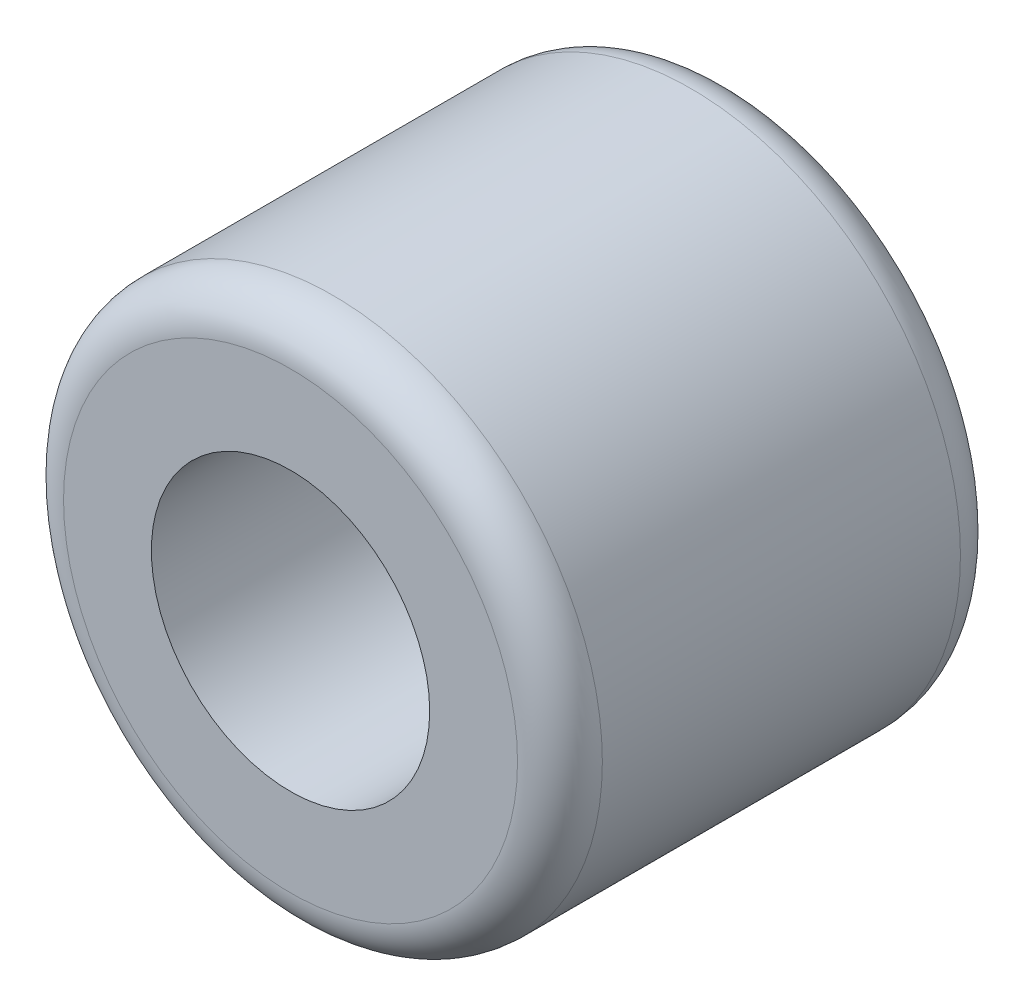
ISO-10303-21;
HEADER;
FILE_DESCRIPTION(('STEP AP214'),'2;1');
FILE_NAME('part.step','',(''),(''),'','','');
FILE_SCHEMA(('AUTOMOTIVE_DESIGN { 1 0 10303 214 1 1 1 1 }'));
ENDSEC;
DATA;
#1=APPLICATION_CONTEXT('core data for automotive mechanical design processes');
#2=APPLICATION_PROTOCOL_DEFINITION('international standard','automotive_design',2000,#1);
#3=PRODUCT_CONTEXT('',#1,'mechanical');
#4=PRODUCT('Part','Part','',(#3));
#5=PRODUCT_RELATED_PRODUCT_CATEGORY('part','',(#4));
#6=PRODUCT_DEFINITION_FORMATION('','',#4);
#7=PRODUCT_DEFINITION_CONTEXT('part definition',#1,'design');
#8=PRODUCT_DEFINITION('design','',#6,#7);
#9=PRODUCT_DEFINITION_SHAPE('','',#8);
#10=(LENGTH_UNIT() NAMED_UNIT(*) SI_UNIT(.MILLI.,.METRE.));
#11=(NAMED_UNIT(*) PLANE_ANGLE_UNIT() SI_UNIT($,.RADIAN.));
#12=(NAMED_UNIT(*) SI_UNIT($,.STERADIAN.) SOLID_ANGLE_UNIT());
#13=UNCERTAINTY_MEASURE_WITH_UNIT(LENGTH_MEASURE(1.E-05),#10,'distance_accuracy_value','');
#14=(GEOMETRIC_REPRESENTATION_CONTEXT(3) GLOBAL_UNCERTAINTY_ASSIGNED_CONTEXT((#13)) GLOBAL_UNIT_ASSIGNED_CONTEXT((#10,
#11,#12)) REPRESENTATION_CONTEXT('',''));
#15=CARTESIAN_POINT('',(0.,0.,0.));
#16=DIRECTION('',(0.,0.,1.));
#17=DIRECTION('',(1.,0.,0.));
#18=AXIS2_PLACEMENT_3D('',#15,#16,#17);
#19=CARTESIAN_POINT('',(4.7625,0.,-6.25));
#20=DIRECTION('',(0.,0.,1.));
#21=DIRECTION('',(1.,0.,0.));
#22=AXIS2_PLACEMENT_3D('',#19,#20,#21);
#23=CYLINDRICAL_SURFACE('',#22,1.64);
#24=CARTESIAN_POINT('',(4.7625,0.,-2.61));
#25=DIRECTION('',(0.,0.,1.));
#26=DIRECTION('',(1.,0.,0.));
#27=AXIS2_PLACEMENT_3D('',#24,#25,#26);
#28=CIRCLE('',#27,1.64);
#29=CARTESIAN_POINT('',(6.4025,0.,-2.61));
#30=VERTEX_POINT('',#29);
#31=EDGE_CURVE('E17',#30,#30,#28,.F.);
#32=ORIENTED_EDGE('',*,*,#31,.T.);
#33=EDGE_LOOP('',(#32));
#34=FACE_BOUND('',#33,.T.);
#35=CARTESIAN_POINT('',(4.7625,0.,2.61));
#36=DIRECTION('',(0.,0.,1.));
#37=DIRECTION('',(1.,0.,0.));
#38=AXIS2_PLACEMENT_3D('',#35,#36,#37);
#39=CIRCLE('',#38,1.64);
#40=CARTESIAN_POINT('',(6.4025,0.,2.61));
#41=VERTEX_POINT('',#40);
#42=EDGE_CURVE('E94',#41,#41,#39,.F.);
#43=ORIENTED_EDGE('',*,*,#42,.F.);
#44=EDGE_LOOP('',(#43));
#45=FACE_BOUND('',#44,.T.);
#46=ADVANCED_FACE('F14',(#34,#45),#23,.F.);
#47=CARTESIAN_POINT('',(4.7625,0.,-2.61));
#48=DIRECTION('',(0.,0.,1.));
#49=DIRECTION('',(1.,0.,0.));
#50=AXIS2_PLACEMENT_3D('',#47,#48,#49);
#51=PLANE('',#50);
#52=ORIENTED_EDGE('',*,*,#31,.F.);
#53=EDGE_LOOP('',(#52));
#54=FACE_BOUND('',#53,.T.);
#55=CARTESIAN_POINT('',(4.7625,0.,-2.61));
#56=DIRECTION('',(0.,0.,1.));
#57=DIRECTION('',(-1.,0.,0.));
#58=AXIS2_PLACEMENT_3D('',#55,#56,#57);
#59=CIRCLE('',#58,2.675);
#60=CARTESIAN_POINT('',(2.0875,0.,-2.61));
#61=VERTEX_POINT('',#60);
#62=EDGE_CURVE('E64',#61,#61,#59,.T.);
#63=ORIENTED_EDGE('',*,*,#62,.F.);
#64=EDGE_LOOP('',(#63));
#65=FACE_BOUND('',#64,.T.);
#66=ADVANCED_FACE('F69',(#54,#65),#51,.F.);
#67=CARTESIAN_POINT('',(4.7625,0.,2.61));
#68=DIRECTION('',(0.,0.,1.));
#69=DIRECTION('',(1.,0.,0.));
#70=AXIS2_PLACEMENT_3D('',#67,#68,#69);
#71=PLANE('',#70);
#72=ORIENTED_EDGE('',*,*,#42,.T.);
#73=EDGE_LOOP('',(#72));
#74=FACE_BOUND('',#73,.T.);
#75=CARTESIAN_POINT('',(4.7625,0.,2.61));
#76=DIRECTION('',(0.,0.,-1.));
#77=DIRECTION('',(-1.,0.,0.));
#78=AXIS2_PLACEMENT_3D('',#75,#76,#77);
#79=CIRCLE('',#78,2.675);
#80=CARTESIAN_POINT('',(2.0875,0.,2.61));
#81=VERTEX_POINT('',#80);
#82=EDGE_CURVE('E30',#81,#81,#79,.T.);
#83=ORIENTED_EDGE('',*,*,#82,.F.);
#84=EDGE_LOOP('',(#83));
#85=FACE_BOUND('',#84,.T.);
#86=ADVANCED_FACE('F77',(#74,#85),#71,.T.);
#87=CARTESIAN_POINT('',(4.7625,0.,-2.11));
#88=DIRECTION('',(0.,0.,-1.));
#89=DIRECTION('',(-1.,0.,0.));
#90=AXIS2_PLACEMENT_3D('',#87,#88,#89);
#91=TOROIDAL_SURFACE('',#90,2.675,0.5);
#92=CARTESIAN_POINT('',(4.7625,0.,-2.11));
#93=DIRECTION('',(0.,0.,1.));
#94=DIRECTION('',(1.,0.,0.));
#95=AXIS2_PLACEMENT_3D('',#92,#93,#94);
#96=CIRCLE('',#95,3.175);
#97=CARTESIAN_POINT('',(7.9375,0.,-2.11));
#98=VERTEX_POINT('',#97);
#99=EDGE_CURVE('E22',#98,#98,#96,.T.);
#100=ORIENTED_EDGE('',*,*,#99,.F.);
#101=EDGE_LOOP('',(#100));
#102=FACE_BOUND('',#101,.T.);
#103=ORIENTED_EDGE('',*,*,#62,.T.);
#104=EDGE_LOOP('',(#103));
#105=FACE_BOUND('',#104,.T.);
#106=ADVANCED_FACE('F44',(#102,#105),#91,.T.);
#107=CARTESIAN_POINT('',(4.7625,0.,2.11));
#108=DIRECTION('',(0.,0.,1.));
#109=DIRECTION('',(-1.,0.,0.));
#110=AXIS2_PLACEMENT_3D('',#107,#108,#109);
#111=TOROIDAL_SURFACE('',#110,2.675,0.5);
#112=CARTESIAN_POINT('',(4.7625,0.,2.11));
#113=DIRECTION('',(0.,0.,1.));
#114=DIRECTION('',(1.,0.,0.));
#115=AXIS2_PLACEMENT_3D('',#112,#113,#114);
#116=CIRCLE('',#115,3.175);
#117=CARTESIAN_POINT('',(7.9375,0.,2.11));
#118=VERTEX_POINT('',#117);
#119=EDGE_CURVE('E10',#118,#118,#116,.F.);
#120=ORIENTED_EDGE('',*,*,#119,.F.);
#121=EDGE_LOOP('',(#120));
#122=FACE_BOUND('',#121,.T.);
#123=ORIENTED_EDGE('',*,*,#82,.T.);
#124=EDGE_LOOP('',(#123));
#125=FACE_BOUND('',#124,.T.);
#126=ADVANCED_FACE('F38',(#122,#125),#111,.T.);
#127=CARTESIAN_POINT('',(4.7625,0.,-2.61));
#128=DIRECTION('',(0.,0.,1.));
#129=DIRECTION('',(1.,0.,0.));
#130=AXIS2_PLACEMENT_3D('',#127,#128,#129);
#131=CYLINDRICAL_SURFACE('',#130,3.175);
#132=ORIENTED_EDGE('',*,*,#119,.T.);
#133=EDGE_LOOP('',(#132));
#134=FACE_BOUND('',#133,.T.);
#135=ORIENTED_EDGE('',*,*,#99,.T.);
#136=EDGE_LOOP('',(#135));
#137=FACE_BOUND('',#136,.T.);
#138=ADVANCED_FACE('F43',(#134,#137),#131,.T.);
#139=CLOSED_SHELL('',(#46,#66,#86,#106,#126,#138));
#140=MANIFOLD_SOLID_BREP('B1',#139);
#141=ADVANCED_BREP_SHAPE_REPRESENTATION('',(#18,#140),#14);
#142=SHAPE_DEFINITION_REPRESENTATION(#9,#141);
ENDSEC;
END-ISO-10303-21;
